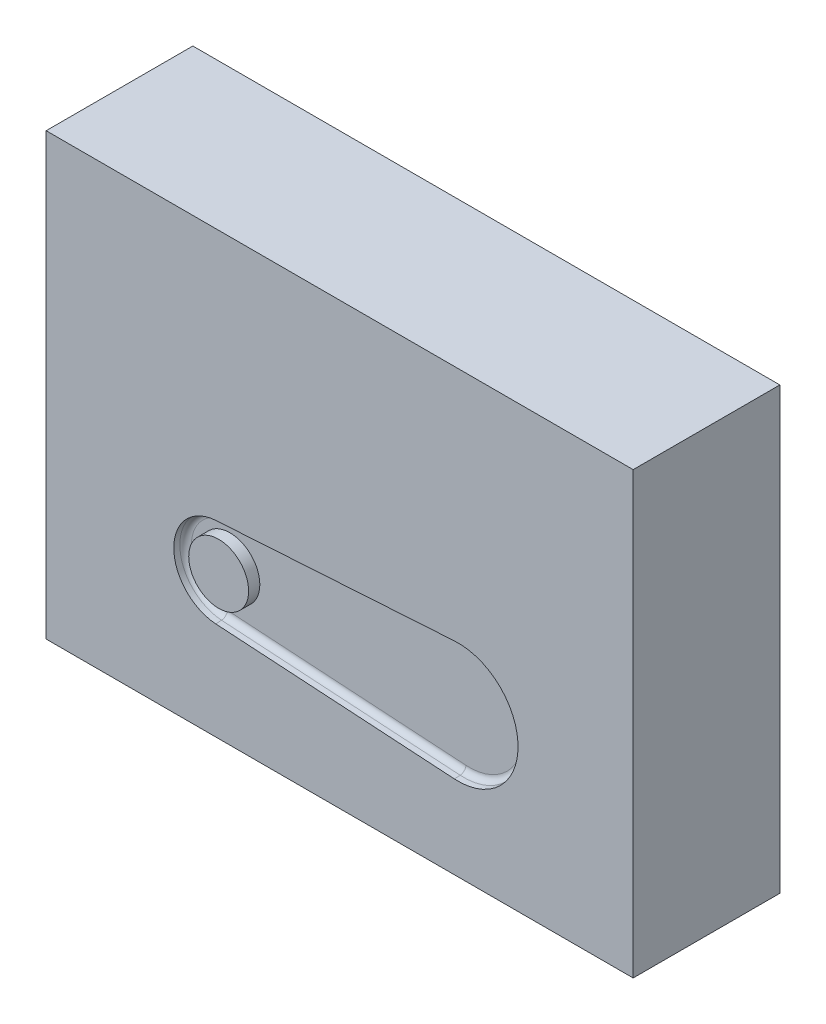
ISO-10303-21;
HEADER;
FILE_DESCRIPTION(('STEP AP214'),'2;1');
FILE_NAME('part.step','',(''),(''),'','','');
FILE_SCHEMA(('AUTOMOTIVE_DESIGN { 1 0 10303 214 1 1 1 1 }'));
ENDSEC;
DATA;
#1=APPLICATION_CONTEXT('core data for automotive mechanical design processes');
#2=APPLICATION_PROTOCOL_DEFINITION('international standard','automotive_design',2000,#1);
#3=PRODUCT_CONTEXT('',#1,'mechanical');
#4=PRODUCT('Part','Part','',(#3));
#5=PRODUCT_RELATED_PRODUCT_CATEGORY('part','',(#4));
#6=PRODUCT_DEFINITION_FORMATION('','',#4);
#7=PRODUCT_DEFINITION_CONTEXT('part definition',#1,'design');
#8=PRODUCT_DEFINITION('design','',#6,#7);
#9=PRODUCT_DEFINITION_SHAPE('','',#8);
#10=(LENGTH_UNIT() NAMED_UNIT(*) SI_UNIT(.MILLI.,.METRE.));
#11=(NAMED_UNIT(*) PLANE_ANGLE_UNIT() SI_UNIT($,.RADIAN.));
#12=(NAMED_UNIT(*) SI_UNIT($,.STERADIAN.) SOLID_ANGLE_UNIT());
#13=UNCERTAINTY_MEASURE_WITH_UNIT(LENGTH_MEASURE(1.E-05),#10,'distance_accuracy_value','');
#14=(GEOMETRIC_REPRESENTATION_CONTEXT(3) GLOBAL_UNCERTAINTY_ASSIGNED_CONTEXT((#13)) GLOBAL_UNIT_ASSIGNED_CONTEXT((#10,
#11,#12)) REPRESENTATION_CONTEXT('',''));
#15=CARTESIAN_POINT('',(0.,0.,0.));
#16=DIRECTION('',(0.,0.,1.));
#17=DIRECTION('',(1.,0.,0.));
#18=AXIS2_PLACEMENT_3D('',#15,#16,#17);
#19=CARTESIAN_POINT('',(786.572800445907,210.744404142702,49.9796360424313));
#20=DIRECTION('',(0.,0.,-1.));
#21=DIRECTION('',(-1.,0.,0.));
#22=AXIS2_PLACEMENT_3D('',#19,#20,#21);
#23=PLANE('',#22);
#24=CARTESIAN_POINT('',(58.7800865151283,48.6496566212927,49.9796360424313));
#25=DIRECTION('',(0.,0.,-1.));
#26=DIRECTION('',(-1.,0.,0.));
#27=AXIS2_PLACEMENT_3D('',#24,#25,#26);
#28=CIRCLE('',#27,10.2);
#29=CARTESIAN_POINT('',(48.5800865151283,48.6496566212927,49.9796360424313));
#30=VERTEX_POINT('',#29);
#31=EDGE_CURVE('E11',#30,#30,#28,.F.);
#32=ORIENTED_EDGE('',*,*,#31,.T.);
#33=EDGE_LOOP('',(#32));
#34=FACE_BOUND('',#33,.T.);
#35=ADVANCED_FACE('F32',(#34),#23,.F.);
#36=CARTESIAN_POINT('',(58.7800865151283,48.6496566212927,49.9796360424313));
#37=DIRECTION('',(0.,0.,1.));
#38=DIRECTION('',(1.,0.,0.));
#39=AXIS2_PLACEMENT_3D('',#36,#37,#38);
#40=CONICAL_SURFACE('',#39,15.3,0.0698131700797733);
#41=DIRECTION('',(-0.00435977960900784,0.0696200973209298,0.997564050259824));
#42=VECTOR('',#41,1.);
#43=CARTESIAN_POINT('',(57.8238365151283,63.9197445692222,49.9796360424313));
#44=LINE('',#43,#42);
#45=CARTESIAN_POINT('',(57.832259650683,63.7852378808905,48.0523328359932));
#46=VERTEX_POINT('',#45);
#47=CARTESIAN_POINT('',(57.8238365151283,63.9197445692222,49.9796360424313));
#48=VERTEX_POINT('',#47);
#49=EDGE_CURVE('E143',#46,#48,#44,.T.);
#50=ORIENTED_EDGE('',*,*,#49,.T.);
#51=CARTESIAN_POINT('',(58.7800865151283,48.6496566212927,49.9796360424313));
#52=DIRECTION('',(0.,0.,1.));
#53=DIRECTION('',(1.,0.,0.));
#54=AXIS2_PLACEMENT_3D('',#51,#52,#53);
#55=CIRCLE('',#54,15.3);
#56=CARTESIAN_POINT('',(57.8238365151283,33.3795686733633,49.9796360424313));
#57=VERTEX_POINT('',#56);
#58=EDGE_CURVE('E136',#48,#57,#55,.T.);
#59=ORIENTED_EDGE('',*,*,#58,.T.);
#60=DIRECTION('',(-0.00435977960900764,-0.0696200973209299,0.997564050259824));
#61=VECTOR('',#60,1.);
#62=CARTESIAN_POINT('',(57.8238365151283,33.3795686733633,49.9796360424313));
#63=LINE('',#62,#61);
#64=CARTESIAN_POINT('',(57.832259650683,33.5140753616949,48.0523328359932));
#65=VERTEX_POINT('',#64);
#66=EDGE_CURVE('E131',#65,#57,#63,.T.);
#67=ORIENTED_EDGE('',*,*,#66,.F.);
#68=CARTESIAN_POINT('',(58.7800865151283,48.6496566212927,48.0523328359932));
#69=DIRECTION('',(0.,0.,1.));
#70=DIRECTION('',(1.,0.,0.));
#71=AXIS2_PLACEMENT_3D('',#68,#69,#70);
#72=CIRCLE('',#71,15.1652298311253);
#73=EDGE_CURVE('E146',#46,#65,#72,.T.);
#74=ORIENTED_EDGE('',*,*,#73,.F.);
#75=EDGE_LOOP('',(#50,#59,#67,#74));
#76=FACE_BOUND('',#75,.T.);
#77=ADVANCED_FACE('F212',(#76),#40,.F.);
#78=CARTESIAN_POINT('',(57.8238365151283,63.9197445692222,49.9796360424313));
#79=DIRECTION('',(-0.062347753141239,0.99561377654642,-0.0697564737441255));
#80=DIRECTION('',(0.,0.0698924504621114,0.997554532528624));
#81=AXIS2_PLACEMENT_3D('',#78,#79,#80);
#82=PLANE('',#81);
#83=DIRECTION('',(-0.0043597796090078,0.0696200973209298,0.997564050259824));
#84=VECTOR('',#83,1.);
#85=CARTESIAN_POINT('',(139.105086515128,69.0097738851986,49.9796360424313));
#86=LINE('',#85,#84);
#87=CARTESIAN_POINT('',(139.113509650683,68.875267196867,48.0523328359932));
#88=VERTEX_POINT('',#87);
#89=CARTESIAN_POINT('',(139.105086515128,69.0097738851986,49.9796360424313));
#90=VERTEX_POINT('',#89);
#91=EDGE_CURVE('E130',#88,#90,#86,.T.);
#92=ORIENTED_EDGE('',*,*,#91,.T.);
#93=DIRECTION('',(0.998044963916957,0.0625,0.));
#94=VECTOR('',#93,1.);
#95=CARTESIAN_POINT('',(57.8238365151283,63.9197445692222,49.9796360424313));
#96=LINE('',#95,#94);
#97=EDGE_CURVE('E117',#48,#90,#96,.T.);
#98=ORIENTED_EDGE('',*,*,#97,.F.);
#99=ORIENTED_EDGE('',*,*,#49,.F.);
#100=DIRECTION('',(0.998044963916957,0.0625,0.));
#101=VECTOR('',#100,1.);
#102=CARTESIAN_POINT('',(57.832259650683,63.7852378808905,48.0523328359932));
#103=LINE('',#102,#101);
#104=EDGE_CURVE('E163',#88,#46,#103,.F.);
#105=ORIENTED_EDGE('',*,*,#104,.F.);
#106=EDGE_LOOP('',(#92,#98,#99,#105));
#107=FACE_BOUND('',#106,.T.);
#108=ADVANCED_FACE('F218',(#107),#82,.F.);
#109=CARTESIAN_POINT('',(140.380086515128,48.6496566212927,49.9796360424313));
#110=DIRECTION('',(0.,0.,1.));
#111=DIRECTION('',(-1.,0.,0.));
#112=AXIS2_PLACEMENT_3D('',#109,#110,#111);
#113=CONICAL_SURFACE('',#112,20.4,0.0698131700797733);
#114=DIRECTION('',(-0.00435977960900784,-0.0696200973209298,0.997564050259824));
#115=VECTOR('',#114,1.);
#116=CARTESIAN_POINT('',(139.105086515128,28.2895393573868,49.9796360424313));
#117=LINE('',#116,#115);
#118=CARTESIAN_POINT('',(139.113509650683,28.4240460457185,48.0523328359932));
#119=VERTEX_POINT('',#118);
#120=CARTESIAN_POINT('',(139.105086515128,28.2895393573868,49.9796360424313));
#121=VERTEX_POINT('',#120);
#122=EDGE_CURVE('E124',#119,#121,#117,.T.);
#123=ORIENTED_EDGE('',*,*,#122,.T.);
#124=CARTESIAN_POINT('',(140.380086515128,48.6496566212927,49.9796360424313));
#125=DIRECTION('',(0.,0.,-1.));
#126=DIRECTION('',(-1.,0.,0.));
#127=AXIS2_PLACEMENT_3D('',#124,#125,#126);
#128=CIRCLE('',#127,20.4);
#129=EDGE_CURVE('E110',#90,#121,#128,.T.);
#130=ORIENTED_EDGE('',*,*,#129,.F.);
#131=ORIENTED_EDGE('',*,*,#91,.F.);
#132=CARTESIAN_POINT('',(140.380086515128,48.6496566212927,48.0523328359933));
#133=DIRECTION('',(0.,0.,-1.));
#134=DIRECTION('',(-1.,0.,0.));
#135=AXIS2_PLACEMENT_3D('',#132,#133,#134);
#136=CIRCLE('',#135,20.2652298311253);
#137=EDGE_CURVE('E126',#119,#88,#136,.F.);
#138=ORIENTED_EDGE('',*,*,#137,.F.);
#139=EDGE_LOOP('',(#123,#130,#131,#138));
#140=FACE_BOUND('',#139,.T.);
#141=ADVANCED_FACE('F125',(#140),#113,.F.);
#142=CARTESIAN_POINT('',(57.8238365151283,33.3795686733633,49.9796360424313));
#143=DIRECTION('',(-0.062347753141239,-0.99561377654642,-0.0697564737441255));
#144=DIRECTION('',(0.,0.0698924504621114,-0.997554532528624));
#145=AXIS2_PLACEMENT_3D('',#142,#143,#144);
#146=PLANE('',#145);
#147=ORIENTED_EDGE('',*,*,#66,.T.);
#148=DIRECTION('',(0.998044963916957,-0.0625,0.));
#149=VECTOR('',#148,1.);
#150=CARTESIAN_POINT('',(57.8238365151283,33.3795686733633,49.9796360424313));
#151=LINE('',#150,#149);
#152=EDGE_CURVE('E114',#57,#121,#151,.T.);
#153=ORIENTED_EDGE('',*,*,#152,.T.);
#154=ORIENTED_EDGE('',*,*,#122,.F.);
#155=DIRECTION('',(0.998044963916957,-0.0625,0.));
#156=VECTOR('',#155,1.);
#157=CARTESIAN_POINT('',(139.113509650683,28.4240460457185,48.0523328359932));
#158=LINE('',#157,#156);
#159=EDGE_CURVE('E160',#65,#119,#158,.T.);
#160=ORIENTED_EDGE('',*,*,#159,.F.);
#161=EDGE_LOOP('',(#147,#153,#154,#160));
#162=FACE_BOUND('',#161,.T.);
#163=ADVANCED_FACE('F133',(#162),#146,.F.);
#164=CARTESIAN_POINT('',(58.7800865151283,48.6496566212927,46.1546360424313));
#165=DIRECTION('',(0.,0.,1.));
#166=DIRECTION('',(1.,0.,0.));
#167=AXIS2_PLACEMENT_3D('',#164,#165,#166);
#168=PLANE('',#167);
#169=DIRECTION('',(0.998044963916957,-0.0625,0.));
#170=VECTOR('',#169,1.);
#171=CARTESIAN_POINT('',(57.9594490670911,35.5451274658496,46.1546360424313));
#172=LINE('',#171,#170);
#173=CARTESIAN_POINT('',(139.240699067091,30.4550981498732,46.1546360424313));
#174=VERTEX_POINT('',#173);
#175=CARTESIAN_POINT('',(57.9594490670911,35.5451274658496,46.1546360424313));
#176=VERTEX_POINT('',#175);
#177=EDGE_CURVE('E155',#174,#176,#172,.F.);
#178=ORIENTED_EDGE('',*,*,#177,.F.);
#179=CARTESIAN_POINT('',(140.380086515128,48.6496566212927,46.1546360424313));
#180=DIRECTION('',(0.,0.,1.));
#181=DIRECTION('',(1.,0.,0.));
#182=AXIS2_PLACEMENT_3D('',#179,#180,#181);
#183=CIRCLE('',#182,18.2301991685952);
#184=CARTESIAN_POINT('',(139.240699067091,66.8442150927123,46.1546360424313));
#185=VERTEX_POINT('',#184);
#186=EDGE_CURVE('E153',#185,#174,#183,.F.);
#187=ORIENTED_EDGE('',*,*,#186,.F.);
#188=DIRECTION('',(-0.998044963916957,-0.0625,0.));
#189=VECTOR('',#188,1.);
#190=CARTESIAN_POINT('',(57.9594490670911,61.7541857767358,46.1546360424313));
#191=LINE('',#190,#189);
#192=CARTESIAN_POINT('',(57.9594490670911,61.7541857767358,46.1546360424313));
#193=VERTEX_POINT('',#192);
#194=EDGE_CURVE('E151',#193,#185,#191,.F.);
#195=ORIENTED_EDGE('',*,*,#194,.F.);
#196=CARTESIAN_POINT('',(58.7800865151283,48.6496566212927,46.1546360424313));
#197=DIRECTION('',(0.,0.,1.));
#198=DIRECTION('',(1.,0.,0.));
#199=AXIS2_PLACEMENT_3D('',#196,#197,#198);
#200=CIRCLE('',#199,13.1301991685952);
#201=EDGE_CURVE('E157',#176,#193,#200,.F.);
#202=ORIENTED_EDGE('',*,*,#201,.F.);
#203=EDGE_LOOP('',(#178,#187,#195,#202));
#204=FACE_BOUND('',#203,.T.);
#205=CARTESIAN_POINT('',(58.7800865151283,48.6496566212927,46.1546360424313));
#206=DIRECTION('',(0.,0.,1.));
#207=DIRECTION('',(1.,0.,0.));
#208=AXIS2_PLACEMENT_3D('',#205,#206,#207);
#209=CIRCLE('',#208,10.2);
#210=CARTESIAN_POINT('',(68.9800865151283,48.6496566212927,46.1546360424313));
#211=VERTEX_POINT('',#210);
#212=EDGE_CURVE('E138',#211,#211,#209,.T.);
#213=ORIENTED_EDGE('',*,*,#212,.F.);
#214=EDGE_LOOP('',(#213));
#215=FACE_BOUND('',#214,.T.);
#216=ADVANCED_FACE('F229',(#204,#215),#168,.T.);
#217=CARTESIAN_POINT('',(58.7800865151283,125.149656621293,49.9796360424313));
#218=DIRECTION('',(0.,0.,1.));
#219=DIRECTION('',(1.,0.,0.));
#220=AXIS2_PLACEMENT_3D('',#217,#218,#219);
#221=PLANE('',#220);
#222=ORIENTED_EDGE('',*,*,#97,.T.);
#223=ORIENTED_EDGE('',*,*,#129,.T.);
#224=ORIENTED_EDGE('',*,*,#152,.F.);
#225=ORIENTED_EDGE('',*,*,#58,.F.);
#226=EDGE_LOOP('',(#222,#223,#224,#225));
#227=FACE_BOUND('',#226,.T.);
#228=DIRECTION('',(1.,0.,0.));
#229=VECTOR('',#228,1.);
#230=CARTESIAN_POINT('',(200.,150.,49.9796360424313));
#231=LINE('',#230,#229);
#232=CARTESIAN_POINT('',(0.,150.,49.9796360424313));
#233=VERTEX_POINT('',#232);
#234=CARTESIAN_POINT('',(200.,150.,49.9796360424313));
#235=VERTEX_POINT('',#234);
#236=EDGE_CURVE('E169',#233,#235,#231,.T.);
#237=ORIENTED_EDGE('',*,*,#236,.F.);
#238=DIRECTION('',(0.,1.,0.));
#239=VECTOR('',#238,1.);
#240=CARTESIAN_POINT('',(0.,150.,49.9796360424313));
#241=LINE('',#240,#239);
#242=CARTESIAN_POINT('',(0.,0.,49.9796360424313));
#243=VERTEX_POINT('',#242);
#244=EDGE_CURVE('E196',#243,#233,#241,.T.);
#245=ORIENTED_EDGE('',*,*,#244,.F.);
#246=DIRECTION('',(-1.,0.,0.));
#247=VECTOR('',#246,1.);
#248=CARTESIAN_POINT('',(0.,0.,49.9796360424313));
#249=LINE('',#248,#247);
#250=CARTESIAN_POINT('',(200.,0.,49.9796360424313));
#251=VERTEX_POINT('',#250);
#252=EDGE_CURVE('E47',#251,#243,#249,.T.);
#253=ORIENTED_EDGE('',*,*,#252,.F.);
#254=DIRECTION('',(0.,-1.,0.));
#255=VECTOR('',#254,1.);
#256=CARTESIAN_POINT('',(200.,0.,49.9796360424313));
#257=LINE('',#256,#255);
#258=EDGE_CURVE('E261',#235,#251,#257,.T.);
#259=ORIENTED_EDGE('',*,*,#258,.F.);
#260=EDGE_LOOP('',(#237,#245,#253,#259));
#261=FACE_BOUND('',#260,.T.);
#262=ADVANCED_FACE('F112',(#227,#261),#221,.T.);
#263=CARTESIAN_POINT('',(58.7800865151283,48.6496566212927,43.6046360424313));
#264=DIRECTION('',(0.,0.,1.));
#265=DIRECTION('',(1.,0.,0.));
#266=AXIS2_PLACEMENT_3D('',#263,#264,#265);
#267=CYLINDRICAL_SURFACE('',#266,10.2);
#268=ORIENTED_EDGE('',*,*,#31,.F.);
#269=EDGE_LOOP('',(#268));
#270=FACE_BOUND('',#269,.T.);
#271=ORIENTED_EDGE('',*,*,#212,.T.);
#272=EDGE_LOOP('',(#271));
#273=FACE_BOUND('',#272,.T.);
#274=ADVANCED_FACE('F222',(#270,#273),#267,.T.);
#275=CARTESIAN_POINT('',(140.380086515128,48.6496566212927,48.1946360424313));
#276=DIRECTION('',(0.,0.,1.));
#277=DIRECTION('',(1.,0.,0.));
#278=AXIS2_PLACEMENT_3D('',#275,#276,#277);
#279=TOROIDAL_SURFACE('',#278,18.2301991685952,2.04);
#280=CARTESIAN_POINT('',(139.240699067091,30.4550981498732,48.1946360424313));
#281=DIRECTION('',(-0.998044963916957,0.0625000000000021,0.));
#282=DIRECTION('',(-0.0625000000000021,-0.998044963916957,0.));
#283=AXIS2_PLACEMENT_3D('',#280,#281,#282);
#284=CIRCLE('',#283,2.04);
#285=EDGE_CURVE('E171',#174,#119,#284,.T.);
#286=ORIENTED_EDGE('',*,*,#285,.T.);
#287=ORIENTED_EDGE('',*,*,#137,.T.);
#288=CARTESIAN_POINT('',(139.240699067091,66.8442150927123,48.1946360424313));
#289=DIRECTION('',(-0.998044963916957,-0.0625000000000021,0.));
#290=DIRECTION('',(0.0625000000000021,-0.998044963916957,0.));
#291=AXIS2_PLACEMENT_3D('',#288,#289,#290);
#292=CIRCLE('',#291,2.04);
#293=EDGE_CURVE('E173',#88,#185,#292,.T.);
#294=ORIENTED_EDGE('',*,*,#293,.T.);
#295=ORIENTED_EDGE('',*,*,#186,.T.);
#296=EDGE_LOOP('',(#286,#287,#294,#295));
#297=FACE_BOUND('',#296,.T.);
#298=ADVANCED_FACE('F225',(#297),#279,.F.);
#299=CARTESIAN_POINT('',(57.9594490670911,61.7541857767358,48.1946360424313));
#300=DIRECTION('',(-0.998044963916957,-0.0625,0.));
#301=DIRECTION('',(0.0625,-0.998044963916957,0.));
#302=AXIS2_PLACEMENT_3D('',#299,#300,#301);
#303=CYLINDRICAL_SURFACE('',#302,2.04);
#304=ORIENTED_EDGE('',*,*,#293,.F.);
#305=ORIENTED_EDGE('',*,*,#104,.T.);
#306=CARTESIAN_POINT('',(57.9594490670911,61.7541857767358,48.1946360424313));
#307=DIRECTION('',(-0.998044963916957,-0.0624999999999997,0.));
#308=DIRECTION('',(0.0624999999999997,-0.998044963916957,0.));
#309=AXIS2_PLACEMENT_3D('',#306,#307,#308);
#310=CIRCLE('',#309,2.04);
#311=EDGE_CURVE('E168',#46,#193,#310,.T.);
#312=ORIENTED_EDGE('',*,*,#311,.T.);
#313=ORIENTED_EDGE('',*,*,#194,.T.);
#314=EDGE_LOOP('',(#304,#305,#312,#313));
#315=FACE_BOUND('',#314,.T.);
#316=ADVANCED_FACE('F242',(#315),#303,.F.);
#317=CARTESIAN_POINT('',(57.9594490670911,35.5451274658496,48.1946360424313));
#318=DIRECTION('',(-0.998044963916957,0.0625,0.));
#319=DIRECTION('',(-0.0625,-0.998044963916957,0.));
#320=AXIS2_PLACEMENT_3D('',#317,#318,#319);
#321=CYLINDRICAL_SURFACE('',#320,2.04);
#322=ORIENTED_EDGE('',*,*,#285,.F.);
#323=ORIENTED_EDGE('',*,*,#177,.T.);
#324=CARTESIAN_POINT('',(57.9594490670911,35.5451274658496,48.1946360424313));
#325=DIRECTION('',(-0.998044963916957,0.0624999999999972,0.));
#326=DIRECTION('',(-0.0624999999999972,-0.998044963916957,0.));
#327=AXIS2_PLACEMENT_3D('',#324,#325,#326);
#328=CIRCLE('',#327,2.04);
#329=EDGE_CURVE('E166',#176,#65,#328,.T.);
#330=ORIENTED_EDGE('',*,*,#329,.T.);
#331=ORIENTED_EDGE('',*,*,#159,.T.);
#332=EDGE_LOOP('',(#322,#323,#330,#331));
#333=FACE_BOUND('',#332,.T.);
#334=ADVANCED_FACE('F208',(#333),#321,.F.);
#335=CARTESIAN_POINT('',(58.7800865151283,48.6496566212927,48.1946360424313));
#336=DIRECTION('',(0.,0.,1.));
#337=DIRECTION('',(1.,0.,0.));
#338=AXIS2_PLACEMENT_3D('',#335,#336,#337);
#339=TOROIDAL_SURFACE('',#338,13.1301991685952,2.04);
#340=ORIENTED_EDGE('',*,*,#311,.F.);
#341=ORIENTED_EDGE('',*,*,#73,.T.);
#342=ORIENTED_EDGE('',*,*,#329,.F.);
#343=ORIENTED_EDGE('',*,*,#201,.T.);
#344=EDGE_LOOP('',(#340,#341,#342,#343));
#345=FACE_BOUND('',#344,.T.);
#346=ADVANCED_FACE('F202',(#345),#339,.F.);
#347=CARTESIAN_POINT('',(200.,150.,100.));
#348=DIRECTION('',(0.,-1.,0.));
#349=DIRECTION('',(1.,0.,0.));
#350=AXIS2_PLACEMENT_3D('',#347,#348,#349);
#351=PLANE('',#350);
#352=DIRECTION('',(0.,0.,-1.));
#353=VECTOR('',#352,1.);
#354=CARTESIAN_POINT('',(0.,150.,100.));
#355=LINE('',#354,#353);
#356=CARTESIAN_POINT('',(0.,150.,0.));
#357=VERTEX_POINT('',#356);
#358=EDGE_CURVE('E40',#233,#357,#355,.T.);
#359=ORIENTED_EDGE('',*,*,#358,.F.);
#360=ORIENTED_EDGE('',*,*,#236,.T.);
#361=DIRECTION('',(0.,0.,-1.));
#362=VECTOR('',#361,1.);
#363=CARTESIAN_POINT('',(200.,150.,100.));
#364=LINE('',#363,#362);
#365=CARTESIAN_POINT('',(200.,150.,0.));
#366=VERTEX_POINT('',#365);
#367=EDGE_CURVE('E55',#235,#366,#364,.T.);
#368=ORIENTED_EDGE('',*,*,#367,.T.);
#369=DIRECTION('',(-1.,0.,0.));
#370=VECTOR('',#369,1.);
#371=CARTESIAN_POINT('',(200.,150.,0.));
#372=LINE('',#371,#370);
#373=EDGE_CURVE('E165',#366,#357,#372,.T.);
#374=ORIENTED_EDGE('',*,*,#373,.T.);
#375=EDGE_LOOP('',(#359,#360,#368,#374));
#376=FACE_BOUND('',#375,.T.);
#377=ADVANCED_FACE('F34',(#376),#351,.F.);
#378=CARTESIAN_POINT('',(0.,150.,100.));
#379=DIRECTION('',(1.,0.,0.));
#380=DIRECTION('',(0.,0.,-1.));
#381=AXIS2_PLACEMENT_3D('',#378,#379,#380);
#382=PLANE('',#381);
#383=DIRECTION('',(0.,0.,-1.));
#384=VECTOR('',#383,1.);
#385=CARTESIAN_POINT('',(0.,0.,100.));
#386=LINE('',#385,#384);
#387=CARTESIAN_POINT('',(0.,0.,0.));
#388=VERTEX_POINT('',#387);
#389=EDGE_CURVE('E188',#243,#388,#386,.T.);
#390=ORIENTED_EDGE('',*,*,#389,.F.);
#391=ORIENTED_EDGE('',*,*,#244,.T.);
#392=ORIENTED_EDGE('',*,*,#358,.T.);
#393=DIRECTION('',(0.,-1.,0.));
#394=VECTOR('',#393,1.);
#395=CARTESIAN_POINT('',(0.,150.,0.));
#396=LINE('',#395,#394);
#397=EDGE_CURVE('E177',#357,#388,#396,.T.);
#398=ORIENTED_EDGE('',*,*,#397,.T.);
#399=EDGE_LOOP('',(#390,#391,#392,#398));
#400=FACE_BOUND('',#399,.T.);
#401=ADVANCED_FACE('F194',(#400),#382,.F.);
#402=CARTESIAN_POINT('',(0.,0.,100.));
#403=DIRECTION('',(0.,1.,0.));
#404=DIRECTION('',(0.,0.,1.));
#405=AXIS2_PLACEMENT_3D('',#402,#403,#404);
#406=PLANE('',#405);
#407=DIRECTION('',(0.,0.,-1.));
#408=VECTOR('',#407,1.);
#409=CARTESIAN_POINT('',(200.,0.,100.));
#410=LINE('',#409,#408);
#411=CARTESIAN_POINT('',(200.,0.,0.));
#412=VERTEX_POINT('',#411);
#413=EDGE_CURVE('E186',#251,#412,#410,.T.);
#414=ORIENTED_EDGE('',*,*,#413,.F.);
#415=ORIENTED_EDGE('',*,*,#252,.T.);
#416=ORIENTED_EDGE('',*,*,#389,.T.);
#417=DIRECTION('',(1.,0.,0.));
#418=VECTOR('',#417,1.);
#419=CARTESIAN_POINT('',(0.,0.,0.));
#420=LINE('',#419,#418);
#421=EDGE_CURVE('E180',#388,#412,#420,.T.);
#422=ORIENTED_EDGE('',*,*,#421,.T.);
#423=EDGE_LOOP('',(#414,#415,#416,#422));
#424=FACE_BOUND('',#423,.T.);
#425=ADVANCED_FACE('F207',(#424),#406,.F.);
#426=CARTESIAN_POINT('',(200.,0.,100.));
#427=DIRECTION('',(-1.,0.,0.));
#428=DIRECTION('',(0.,0.,1.));
#429=AXIS2_PLACEMENT_3D('',#426,#427,#428);
#430=PLANE('',#429);
#431=ORIENTED_EDGE('',*,*,#367,.F.);
#432=ORIENTED_EDGE('',*,*,#258,.T.);
#433=ORIENTED_EDGE('',*,*,#413,.T.);
#434=DIRECTION('',(0.,1.,0.));
#435=VECTOR('',#434,1.);
#436=CARTESIAN_POINT('',(200.,0.,0.));
#437=LINE('',#436,#435);
#438=EDGE_CURVE('E183',#412,#366,#437,.T.);
#439=ORIENTED_EDGE('',*,*,#438,.T.);
#440=EDGE_LOOP('',(#431,#432,#433,#439));
#441=FACE_BOUND('',#440,.T.);
#442=ADVANCED_FACE('F252',(#441),#430,.F.);
#443=CARTESIAN_POINT('',(0.,0.,0.));
#444=DIRECTION('',(0.,0.,1.));
#445=DIRECTION('',(1.,0.,0.));
#446=AXIS2_PLACEMENT_3D('',#443,#444,#445);
#447=PLANE('',#446);
#448=ORIENTED_EDGE('',*,*,#373,.F.);
#449=ORIENTED_EDGE('',*,*,#438,.F.);
#450=ORIENTED_EDGE('',*,*,#421,.F.);
#451=ORIENTED_EDGE('',*,*,#397,.F.);
#452=EDGE_LOOP('',(#448,#449,#450,#451));
#453=FACE_BOUND('',#452,.T.);
#454=ADVANCED_FACE('F199',(#453),#447,.F.);
#455=CLOSED_SHELL('',(#35,#77,#108,#141,#163,#216,#262,#274,#298,#316,#334,#346,#377,#401,#425,
#442,#454));
#456=MANIFOLD_SOLID_BREP('B2',#455);
#457=ADVANCED_BREP_SHAPE_REPRESENTATION('',(#18,#456),#14);
#458=SHAPE_DEFINITION_REPRESENTATION(#9,#457);
ENDSEC;
END-ISO-10303-21;
